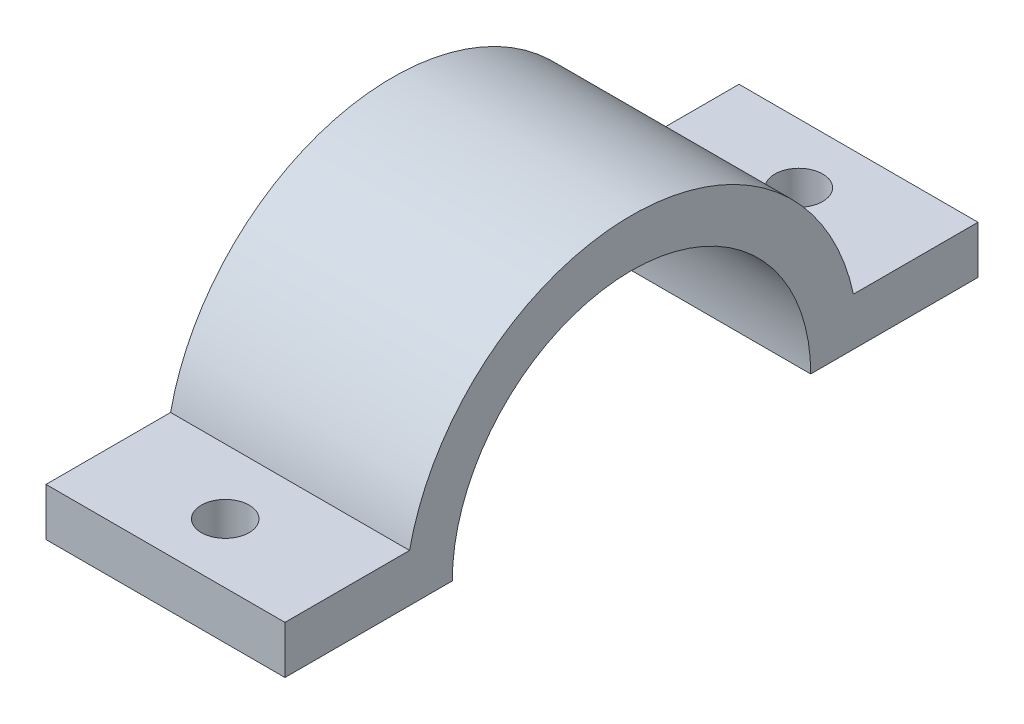
ISO-10303-21;
HEADER;
FILE_DESCRIPTION(('STEP AP214'),'2;1');
FILE_NAME('part.step','',(''),(''),'','','');
FILE_SCHEMA(('AUTOMOTIVE_DESIGN { 1 0 10303 214 1 1 1 1 }'));
ENDSEC;
DATA;
#1=APPLICATION_CONTEXT('core data for automotive mechanical design processes');
#2=APPLICATION_PROTOCOL_DEFINITION('international standard','automotive_design',2000,#1);
#3=PRODUCT_CONTEXT('',#1,'mechanical');
#4=PRODUCT('Part','Part','',(#3));
#5=PRODUCT_RELATED_PRODUCT_CATEGORY('part','',(#4));
#6=PRODUCT_DEFINITION_FORMATION('','',#4);
#7=PRODUCT_DEFINITION_CONTEXT('part definition',#1,'design');
#8=PRODUCT_DEFINITION('design','',#6,#7);
#9=PRODUCT_DEFINITION_SHAPE('','',#8);
#10=(LENGTH_UNIT() NAMED_UNIT(*) SI_UNIT(.MILLI.,.METRE.));
#11=(NAMED_UNIT(*) PLANE_ANGLE_UNIT() SI_UNIT($,.RADIAN.));
#12=(NAMED_UNIT(*) SI_UNIT($,.STERADIAN.) SOLID_ANGLE_UNIT());
#13=UNCERTAINTY_MEASURE_WITH_UNIT(LENGTH_MEASURE(1.E-05),#10,'distance_accuracy_value','');
#14=(GEOMETRIC_REPRESENTATION_CONTEXT(3) GLOBAL_UNCERTAINTY_ASSIGNED_CONTEXT((#13)) GLOBAL_UNIT_ASSIGNED_CONTEXT((#10,
#11,#12)) REPRESENTATION_CONTEXT('',''));
#15=CARTESIAN_POINT('',(0.,0.,0.));
#16=DIRECTION('',(0.,0.,1.));
#17=DIRECTION('',(1.,0.,0.));
#18=AXIS2_PLACEMENT_3D('',#15,#16,#17);
#19=CARTESIAN_POINT('',(10.,0.,0.));
#20=DIRECTION('',(-1.,0.,0.));
#21=DIRECTION('',(0.,0.,1.));
#22=AXIS2_PLACEMENT_3D('',#19,#20,#21);
#23=CYLINDRICAL_SURFACE('',#22,7.5);
#24=CARTESIAN_POINT('',(0.,0.,0.));
#25=DIRECTION('',(-1.,0.,0.));
#26=DIRECTION('',(0.,0.,1.));
#27=AXIS2_PLACEMENT_3D('',#24,#25,#26);
#28=CIRCLE('',#27,7.5);
#29=CARTESIAN_POINT('',(0.,0.,7.5));
#30=VERTEX_POINT('',#29);
#31=CARTESIAN_POINT('',(0.,0.,-7.5));
#32=VERTEX_POINT('',#31);
#33=EDGE_CURVE('E140',#30,#32,#28,.T.);
#34=ORIENTED_EDGE('',*,*,#33,.T.);
#35=DIRECTION('',(-1.,0.,0.));
#36=VECTOR('',#35,1.);
#37=CARTESIAN_POINT('',(10.,0.,-7.5));
#38=LINE('',#37,#36);
#39=CARTESIAN_POINT('',(10.,0.,-7.5));
#40=VERTEX_POINT('',#39);
#41=EDGE_CURVE('E11',#40,#32,#38,.T.);
#42=ORIENTED_EDGE('',*,*,#41,.F.);
#43=CARTESIAN_POINT('',(10.,0.,0.));
#44=DIRECTION('',(-1.,0.,0.));
#45=DIRECTION('',(0.,0.,1.));
#46=AXIS2_PLACEMENT_3D('',#43,#44,#45);
#47=CIRCLE('',#46,7.5);
#48=CARTESIAN_POINT('',(10.,0.,7.5));
#49=VERTEX_POINT('',#48);
#50=EDGE_CURVE('E163',#49,#40,#47,.T.);
#51=ORIENTED_EDGE('',*,*,#50,.F.);
#52=DIRECTION('',(-1.,0.,0.));
#53=VECTOR('',#52,1.);
#54=CARTESIAN_POINT('',(10.,0.,7.5));
#55=LINE('',#54,#53);
#56=EDGE_CURVE('E136',#49,#30,#55,.T.);
#57=ORIENTED_EDGE('',*,*,#56,.T.);
#58=EDGE_LOOP('',(#34,#42,#51,#57));
#59=FACE_BOUND('',#58,.T.);
#60=ADVANCED_FACE('F39',(#59),#23,.F.);
#61=CARTESIAN_POINT('',(10.,0.,-7.5));
#62=DIRECTION('',(0.,1.,0.));
#63=DIRECTION('',(0.,0.,1.));
#64=AXIS2_PLACEMENT_3D('',#61,#62,#63);
#65=PLANE('',#64);
#66=CARTESIAN_POINT('',(5.,0.,-12.));
#67=DIRECTION('',(0.,1.,0.));
#68=DIRECTION('',(0.,0.,1.));
#69=AXIS2_PLACEMENT_3D('',#66,#67,#68);
#70=CIRCLE('',#69,1.);
#71=CARTESIAN_POINT('',(5.,0.,-11.));
#72=VERTEX_POINT('',#71);
#73=EDGE_CURVE('E145',#72,#72,#70,.T.);
#74=ORIENTED_EDGE('',*,*,#73,.T.);
#75=EDGE_LOOP('',(#74));
#76=FACE_BOUND('',#75,.T.);
#77=DIRECTION('',(0.,0.,-1.));
#78=VECTOR('',#77,1.);
#79=CARTESIAN_POINT('',(0.,0.,-7.5));
#80=LINE('',#79,#78);
#81=CARTESIAN_POINT('',(0.,0.,-14.5));
#82=VERTEX_POINT('',#81);
#83=EDGE_CURVE('E144',#32,#82,#80,.T.);
#84=ORIENTED_EDGE('',*,*,#83,.T.);
#85=DIRECTION('',(-1.,0.,0.));
#86=VECTOR('',#85,1.);
#87=CARTESIAN_POINT('',(10.,0.,-14.5));
#88=LINE('',#87,#86);
#89=CARTESIAN_POINT('',(10.,0.,-14.5));
#90=VERTEX_POINT('',#89);
#91=EDGE_CURVE('E48',#90,#82,#88,.T.);
#92=ORIENTED_EDGE('',*,*,#91,.F.);
#93=DIRECTION('',(0.,0.,-1.));
#94=VECTOR('',#93,1.);
#95=CARTESIAN_POINT('',(10.,0.,-7.5));
#96=LINE('',#95,#94);
#97=EDGE_CURVE('E99',#40,#90,#96,.T.);
#98=ORIENTED_EDGE('',*,*,#97,.F.);
#99=ORIENTED_EDGE('',*,*,#41,.T.);
#100=EDGE_LOOP('',(#84,#92,#98,#99));
#101=FACE_BOUND('',#100,.T.);
#102=ADVANCED_FACE('F236',(#76,#101),#65,.F.);
#103=CARTESIAN_POINT('',(10.,0.,-14.5));
#104=DIRECTION('',(0.,0.,1.));
#105=DIRECTION('',(1.,0.,0.));
#106=AXIS2_PLACEMENT_3D('',#103,#104,#105);
#107=PLANE('',#106);
#108=DIRECTION('',(0.,1.,0.));
#109=VECTOR('',#108,1.);
#110=CARTESIAN_POINT('',(0.,0.,-14.5));
#111=LINE('',#110,#109);
#112=CARTESIAN_POINT('',(0.,2.,-14.5));
#113=VERTEX_POINT('',#112);
#114=EDGE_CURVE('E148',#82,#113,#111,.T.);
#115=ORIENTED_EDGE('',*,*,#114,.T.);
#116=DIRECTION('',(-1.,0.,0.));
#117=VECTOR('',#116,1.);
#118=CARTESIAN_POINT('',(10.,2.,-14.5));
#119=LINE('',#118,#117);
#120=CARTESIAN_POINT('',(10.,2.,-14.5));
#121=VERTEX_POINT('',#120);
#122=EDGE_CURVE('E174',#121,#113,#119,.T.);
#123=ORIENTED_EDGE('',*,*,#122,.F.);
#124=DIRECTION('',(0.,1.,0.));
#125=VECTOR('',#124,1.);
#126=CARTESIAN_POINT('',(10.,0.,-14.5));
#127=LINE('',#126,#125);
#128=EDGE_CURVE('E184',#90,#121,#127,.T.);
#129=ORIENTED_EDGE('',*,*,#128,.F.);
#130=ORIENTED_EDGE('',*,*,#91,.T.);
#131=EDGE_LOOP('',(#115,#123,#129,#130));
#132=FACE_BOUND('',#131,.T.);
#133=ADVANCED_FACE('F182',(#132),#107,.F.);
#134=CARTESIAN_POINT('',(10.,2.,-14.5));
#135=DIRECTION('',(0.,-1.,0.));
#136=DIRECTION('',(0.,0.,-1.));
#137=AXIS2_PLACEMENT_3D('',#134,#135,#136);
#138=PLANE('',#137);
#139=CARTESIAN_POINT('',(5.,2.,-12.));
#140=DIRECTION('',(0.,1.,0.));
#141=DIRECTION('',(0.,0.,1.));
#142=AXIS2_PLACEMENT_3D('',#139,#140,#141);
#143=CIRCLE('',#142,1.);
#144=CARTESIAN_POINT('',(5.,2.,-11.));
#145=VERTEX_POINT('',#144);
#146=EDGE_CURVE('E207',#145,#145,#143,.T.);
#147=ORIENTED_EDGE('',*,*,#146,.F.);
#148=EDGE_LOOP('',(#147));
#149=FACE_BOUND('',#148,.T.);
#150=DIRECTION('',(0.,0.,1.));
#151=VECTOR('',#150,1.);
#152=CARTESIAN_POINT('',(0.,2.,-14.5));
#153=LINE('',#152,#151);
#154=CARTESIAN_POINT('',(0.,2.,-9.28708781050335));
#155=VERTEX_POINT('',#154);
#156=EDGE_CURVE('E151',#113,#155,#153,.T.);
#157=ORIENTED_EDGE('',*,*,#156,.T.);
#158=DIRECTION('',(-1.,0.,0.));
#159=VECTOR('',#158,1.);
#160=CARTESIAN_POINT('',(10.,2.,-9.28708781050335));
#161=LINE('',#160,#159);
#162=CARTESIAN_POINT('',(10.,2.,-9.28708781050335));
#163=VERTEX_POINT('',#162);
#164=EDGE_CURVE('E170',#163,#155,#161,.T.);
#165=ORIENTED_EDGE('',*,*,#164,.F.);
#166=DIRECTION('',(0.,0.,1.));
#167=VECTOR('',#166,1.);
#168=CARTESIAN_POINT('',(10.,2.,-14.5));
#169=LINE('',#168,#167);
#170=EDGE_CURVE('E197',#121,#163,#169,.T.);
#171=ORIENTED_EDGE('',*,*,#170,.F.);
#172=ORIENTED_EDGE('',*,*,#122,.T.);
#173=EDGE_LOOP('',(#157,#165,#171,#172));
#174=FACE_BOUND('',#173,.T.);
#175=ADVANCED_FACE('F192',(#149,#174),#138,.F.);
#176=CARTESIAN_POINT('',(10.,0.,0.));
#177=DIRECTION('',(-1.,0.,0.));
#178=DIRECTION('',(0.,0.,1.));
#179=AXIS2_PLACEMENT_3D('',#176,#177,#178);
#180=CYLINDRICAL_SURFACE('',#179,9.5);
#181=CARTESIAN_POINT('',(0.,0.,0.));
#182=DIRECTION('',(1.,0.,0.));
#183=DIRECTION('',(0.,0.,1.));
#184=AXIS2_PLACEMENT_3D('',#181,#182,#183);
#185=CIRCLE('',#184,9.5);
#186=CARTESIAN_POINT('',(0.,2.,9.28708781050335));
#187=VERTEX_POINT('',#186);
#188=EDGE_CURVE('E154',#155,#187,#185,.T.);
#189=ORIENTED_EDGE('',*,*,#188,.T.);
#190=DIRECTION('',(-1.,0.,0.));
#191=VECTOR('',#190,1.);
#192=CARTESIAN_POINT('',(10.,2.,9.28708781050335));
#193=LINE('',#192,#191);
#194=CARTESIAN_POINT('',(10.,2.,9.28708781050335));
#195=VERTEX_POINT('',#194);
#196=EDGE_CURVE('E129',#195,#187,#193,.T.);
#197=ORIENTED_EDGE('',*,*,#196,.F.);
#198=CARTESIAN_POINT('',(10.,0.,0.));
#199=DIRECTION('',(1.,0.,0.));
#200=DIRECTION('',(0.,0.,1.));
#201=AXIS2_PLACEMENT_3D('',#198,#199,#200);
#202=CIRCLE('',#201,9.5);
#203=EDGE_CURVE('E118',#163,#195,#202,.T.);
#204=ORIENTED_EDGE('',*,*,#203,.F.);
#205=ORIENTED_EDGE('',*,*,#164,.T.);
#206=EDGE_LOOP('',(#189,#197,#204,#205));
#207=FACE_BOUND('',#206,.T.);
#208=ADVANCED_FACE('F195',(#207),#180,.T.);
#209=CARTESIAN_POINT('',(10.,2.,14.5));
#210=DIRECTION('',(0.,-1.,0.));
#211=DIRECTION('',(0.,0.,-1.));
#212=AXIS2_PLACEMENT_3D('',#209,#210,#211);
#213=PLANE('',#212);
#214=CARTESIAN_POINT('',(5.,2.,12.));
#215=DIRECTION('',(0.,1.,0.));
#216=DIRECTION('',(0.,0.,1.));
#217=AXIS2_PLACEMENT_3D('',#214,#215,#216);
#218=CIRCLE('',#217,1.);
#219=CARTESIAN_POINT('',(5.,2.,13.));
#220=VERTEX_POINT('',#219);
#221=EDGE_CURVE('E211',#220,#220,#218,.T.);
#222=ORIENTED_EDGE('',*,*,#221,.F.);
#223=EDGE_LOOP('',(#222));
#224=FACE_BOUND('',#223,.T.);
#225=DIRECTION('',(0.,0.,1.));
#226=VECTOR('',#225,1.);
#227=CARTESIAN_POINT('',(0.,2.,14.5));
#228=LINE('',#227,#226);
#229=CARTESIAN_POINT('',(0.,2.,14.5));
#230=VERTEX_POINT('',#229);
#231=EDGE_CURVE('E127',#187,#230,#228,.T.);
#232=ORIENTED_EDGE('',*,*,#231,.T.);
#233=DIRECTION('',(-1.,0.,0.));
#234=VECTOR('',#233,1.);
#235=CARTESIAN_POINT('',(10.,2.,14.5));
#236=LINE('',#235,#234);
#237=CARTESIAN_POINT('',(10.,2.,14.5));
#238=VERTEX_POINT('',#237);
#239=EDGE_CURVE('E124',#238,#230,#236,.T.);
#240=ORIENTED_EDGE('',*,*,#239,.F.);
#241=DIRECTION('',(0.,0.,1.));
#242=VECTOR('',#241,1.);
#243=CARTESIAN_POINT('',(10.,2.,14.5));
#244=LINE('',#243,#242);
#245=EDGE_CURVE('E112',#195,#238,#244,.T.);
#246=ORIENTED_EDGE('',*,*,#245,.F.);
#247=ORIENTED_EDGE('',*,*,#196,.T.);
#248=EDGE_LOOP('',(#232,#240,#246,#247));
#249=FACE_BOUND('',#248,.T.);
#250=ADVANCED_FACE('F125',(#224,#249),#213,.F.);
#251=CARTESIAN_POINT('',(10.,0.,14.5));
#252=DIRECTION('',(0.,0.,-1.));
#253=DIRECTION('',(-1.,0.,0.));
#254=AXIS2_PLACEMENT_3D('',#251,#252,#253);
#255=PLANE('',#254);
#256=DIRECTION('',(0.,-1.,0.));
#257=VECTOR('',#256,1.);
#258=CARTESIAN_POINT('',(0.,0.,14.5));
#259=LINE('',#258,#257);
#260=CARTESIAN_POINT('',(0.,0.,14.5));
#261=VERTEX_POINT('',#260);
#262=EDGE_CURVE('E85',#230,#261,#259,.T.);
#263=ORIENTED_EDGE('',*,*,#262,.T.);
#264=DIRECTION('',(-1.,0.,0.));
#265=VECTOR('',#264,1.);
#266=CARTESIAN_POINT('',(10.,0.,14.5));
#267=LINE('',#266,#265);
#268=CARTESIAN_POINT('',(10.,0.,14.5));
#269=VERTEX_POINT('',#268);
#270=EDGE_CURVE('E130',#269,#261,#267,.T.);
#271=ORIENTED_EDGE('',*,*,#270,.F.);
#272=DIRECTION('',(0.,-1.,0.));
#273=VECTOR('',#272,1.);
#274=CARTESIAN_POINT('',(10.,0.,14.5));
#275=LINE('',#274,#273);
#276=EDGE_CURVE('E116',#238,#269,#275,.T.);
#277=ORIENTED_EDGE('',*,*,#276,.F.);
#278=ORIENTED_EDGE('',*,*,#239,.T.);
#279=EDGE_LOOP('',(#263,#271,#277,#278));
#280=FACE_BOUND('',#279,.T.);
#281=ADVANCED_FACE('F132',(#280),#255,.F.);
#282=CARTESIAN_POINT('',(10.,0.,7.5));
#283=DIRECTION('',(0.,1.,0.));
#284=DIRECTION('',(0.,0.,1.));
#285=AXIS2_PLACEMENT_3D('',#282,#283,#284);
#286=PLANE('',#285);
#287=CARTESIAN_POINT('',(5.,0.,12.));
#288=DIRECTION('',(0.,1.,0.));
#289=DIRECTION('',(0.,0.,1.));
#290=AXIS2_PLACEMENT_3D('',#287,#288,#289);
#291=CIRCLE('',#290,1.);
#292=CARTESIAN_POINT('',(5.,0.,13.));
#293=VERTEX_POINT('',#292);
#294=EDGE_CURVE('E215',#293,#293,#291,.T.);
#295=ORIENTED_EDGE('',*,*,#294,.T.);
#296=EDGE_LOOP('',(#295));
#297=FACE_BOUND('',#296,.T.);
#298=DIRECTION('',(0.,0.,-1.));
#299=VECTOR('',#298,1.);
#300=CARTESIAN_POINT('',(0.,0.,7.5));
#301=LINE('',#300,#299);
#302=EDGE_CURVE('E91',#261,#30,#301,.T.);
#303=ORIENTED_EDGE('',*,*,#302,.T.);
#304=ORIENTED_EDGE('',*,*,#56,.F.);
#305=DIRECTION('',(0.,0.,-1.));
#306=VECTOR('',#305,1.);
#307=CARTESIAN_POINT('',(10.,0.,7.5));
#308=LINE('',#307,#306);
#309=EDGE_CURVE('E56',#269,#49,#308,.T.);
#310=ORIENTED_EDGE('',*,*,#309,.F.);
#311=ORIENTED_EDGE('',*,*,#270,.T.);
#312=EDGE_LOOP('',(#303,#304,#310,#311));
#313=FACE_BOUND('',#312,.T.);
#314=ADVANCED_FACE('F232',(#297,#313),#286,.F.);
#315=CARTESIAN_POINT('',(10.,0.,0.));
#316=DIRECTION('',(-1.,0.,0.));
#317=DIRECTION('',(0.,0.,1.));
#318=AXIS2_PLACEMENT_3D('',#315,#316,#317);
#319=PLANE('',#318);
#320=ORIENTED_EDGE('',*,*,#50,.T.);
#321=ORIENTED_EDGE('',*,*,#97,.T.);
#322=ORIENTED_EDGE('',*,*,#128,.T.);
#323=ORIENTED_EDGE('',*,*,#170,.T.);
#324=ORIENTED_EDGE('',*,*,#203,.T.);
#325=ORIENTED_EDGE('',*,*,#245,.T.);
#326=ORIENTED_EDGE('',*,*,#276,.T.);
#327=ORIENTED_EDGE('',*,*,#309,.T.);
#328=EDGE_LOOP('',(#320,#321,#322,#323,#324,#325,#326,#327));
#329=FACE_BOUND('',#328,.T.);
#330=ADVANCED_FACE('F114',(#329),#319,.F.);
#331=CARTESIAN_POINT('',(0.,0.,0.));
#332=DIRECTION('',(-1.,0.,0.));
#333=DIRECTION('',(0.,0.,1.));
#334=AXIS2_PLACEMENT_3D('',#331,#332,#333);
#335=PLANE('',#334);
#336=ORIENTED_EDGE('',*,*,#33,.F.);
#337=ORIENTED_EDGE('',*,*,#302,.F.);
#338=ORIENTED_EDGE('',*,*,#262,.F.);
#339=ORIENTED_EDGE('',*,*,#231,.F.);
#340=ORIENTED_EDGE('',*,*,#188,.F.);
#341=ORIENTED_EDGE('',*,*,#156,.F.);
#342=ORIENTED_EDGE('',*,*,#114,.F.);
#343=ORIENTED_EDGE('',*,*,#83,.F.);
#344=EDGE_LOOP('',(#336,#337,#338,#339,#340,#341,#342,#343));
#345=FACE_BOUND('',#344,.T.);
#346=ADVANCED_FACE('F188',(#345),#335,.T.);
#347=CARTESIAN_POINT('',(5.,0.,-12.));
#348=DIRECTION('',(0.,1.,0.));
#349=DIRECTION('',(0.,0.,1.));
#350=AXIS2_PLACEMENT_3D('',#347,#348,#349);
#351=CYLINDRICAL_SURFACE('',#350,1.);
#352=ORIENTED_EDGE('',*,*,#73,.F.);
#353=EDGE_LOOP('',(#352));
#354=FACE_BOUND('',#353,.T.);
#355=ORIENTED_EDGE('',*,*,#146,.T.);
#356=EDGE_LOOP('',(#355));
#357=FACE_BOUND('',#356,.T.);
#358=ADVANCED_FACE('F253',(#354,#357),#351,.F.);
#359=CARTESIAN_POINT('',(5.,2.,12.));
#360=DIRECTION('',(0.,-1.,0.));
#361=DIRECTION('',(0.,0.,-1.));
#362=AXIS2_PLACEMENT_3D('',#359,#360,#361);
#363=CYLINDRICAL_SURFACE('',#362,1.);
#364=ORIENTED_EDGE('',*,*,#221,.T.);
#365=EDGE_LOOP('',(#364));
#366=FACE_BOUND('',#365,.T.);
#367=ORIENTED_EDGE('',*,*,#294,.F.);
#368=EDGE_LOOP('',(#367));
#369=FACE_BOUND('',#368,.T.);
#370=ADVANCED_FACE('F223',(#366,#369),#363,.F.);
#371=CLOSED_SHELL('',(#60,#102,#133,#175,#208,#250,#281,#314,#330,#346,#358,#370));
#372=MANIFOLD_SOLID_BREP('B2',#371);
#373=ADVANCED_BREP_SHAPE_REPRESENTATION('',(#18,#372),#14);
#374=SHAPE_DEFINITION_REPRESENTATION(#9,#373);
ENDSEC;
END-ISO-10303-21;
